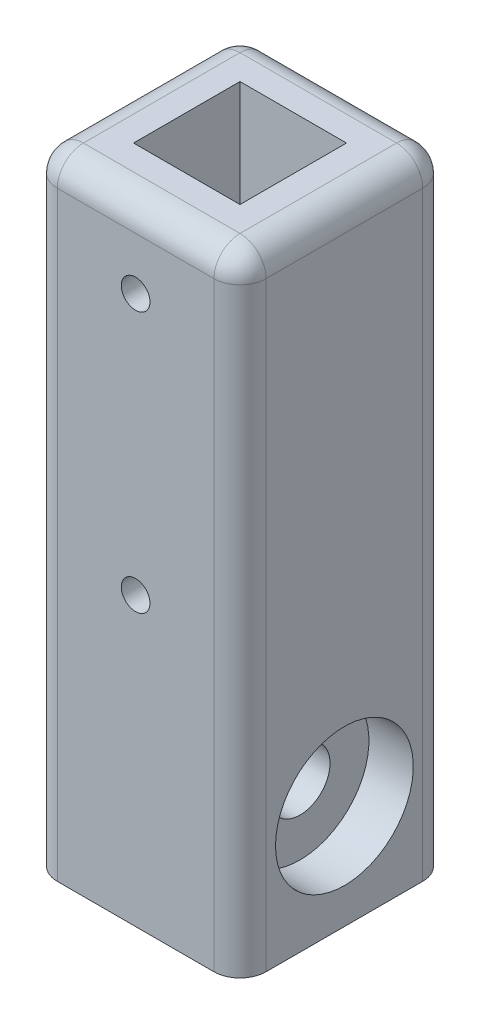
ISO-10303-21;
HEADER;
FILE_DESCRIPTION(('STEP AP214'),'2;1');
FILE_NAME('part.step','',(''),(''),'','','');
FILE_SCHEMA(('AUTOMOTIVE_DESIGN { 1 0 10303 214 1 1 1 1 }'));
ENDSEC;
DATA;
#1=APPLICATION_CONTEXT('core data for automotive mechanical design processes');
#2=APPLICATION_PROTOCOL_DEFINITION('international standard','automotive_design',2000,#1);
#3=PRODUCT_CONTEXT('',#1,'mechanical');
#4=PRODUCT('Part','Part','',(#3));
#5=PRODUCT_RELATED_PRODUCT_CATEGORY('part','',(#4));
#6=PRODUCT_DEFINITION_FORMATION('','',#4);
#7=PRODUCT_DEFINITION_CONTEXT('part definition',#1,'design');
#8=PRODUCT_DEFINITION('design','',#6,#7);
#9=PRODUCT_DEFINITION_SHAPE('','',#8);
#10=(LENGTH_UNIT() NAMED_UNIT(*) SI_UNIT(.MILLI.,.METRE.));
#11=(NAMED_UNIT(*) PLANE_ANGLE_UNIT() SI_UNIT($,.RADIAN.));
#12=(NAMED_UNIT(*) SI_UNIT($,.STERADIAN.) SOLID_ANGLE_UNIT());
#13=UNCERTAINTY_MEASURE_WITH_UNIT(LENGTH_MEASURE(1.E-05),#10,'distance_accuracy_value','');
#14=(GEOMETRIC_REPRESENTATION_CONTEXT(3) GLOBAL_UNCERTAINTY_ASSIGNED_CONTEXT((#13)) GLOBAL_UNIT_ASSIGNED_CONTEXT((#10,
#11,#12)) REPRESENTATION_CONTEXT('',''));
#15=CARTESIAN_POINT('',(0.,0.,0.));
#16=DIRECTION('',(0.,0.,1.));
#17=DIRECTION('',(1.,0.,0.));
#18=AXIS2_PLACEMENT_3D('',#15,#16,#17);
#19=CARTESIAN_POINT('',(0.,80.,0.));
#20=DIRECTION('',(0.,-1.,0.));
#21=DIRECTION('',(0.,0.,-1.));
#22=AXIS2_PLACEMENT_3D('',#19,#20,#21);
#23=PLANE('',#22);
#24=DIRECTION('',(0.,0.,1.));
#25=VECTOR('',#24,1.);
#26=CARTESIAN_POINT('',(-4.8,80.,0.));
#27=LINE('',#26,#25);
#28=CARTESIAN_POINT('',(-4.8,80.,-25.2));
#29=VERTEX_POINT('',#28);
#30=CARTESIAN_POINT('',(-4.8,80.,4.8));
#31=VERTEX_POINT('',#30);
#32=EDGE_CURVE('E225',#29,#31,#27,.T.);
#33=ORIENTED_EDGE('',*,*,#32,.T.);
#34=DIRECTION('',(1.,0.,0.));
#35=VECTOR('',#34,1.);
#36=CARTESIAN_POINT('',(0.,80.,4.8));
#37=LINE('',#36,#35);
#38=CARTESIAN_POINT('',(25.2,80.,4.8));
#39=VERTEX_POINT('',#38);
#40=EDGE_CURVE('E227',#31,#39,#37,.T.);
#41=ORIENTED_EDGE('',*,*,#40,.T.);
#42=DIRECTION('',(0.,0.,-1.));
#43=VECTOR('',#42,1.);
#44=CARTESIAN_POINT('',(25.2,80.,0.));
#45=LINE('',#44,#43);
#46=CARTESIAN_POINT('',(25.2,80.,-25.2));
#47=VERTEX_POINT('',#46);
#48=EDGE_CURVE('E221',#39,#47,#45,.T.);
#49=ORIENTED_EDGE('',*,*,#48,.T.);
#50=DIRECTION('',(-1.,0.,0.));
#51=VECTOR('',#50,1.);
#52=CARTESIAN_POINT('',(0.,80.,-25.2));
#53=LINE('',#52,#51);
#54=EDGE_CURVE('E223',#47,#29,#53,.T.);
#55=ORIENTED_EDGE('',*,*,#54,.T.);
#56=EDGE_LOOP('',(#33,#41,#49,#55));
#57=FACE_BOUND('',#56,.T.);
#58=DIRECTION('',(0.,0.,1.));
#59=VECTOR('',#58,1.);
#60=CARTESIAN_POINT('',(0.,80.,0.));
#61=LINE('',#60,#59);
#62=CARTESIAN_POINT('',(0.,80.,-20.4));
#63=VERTEX_POINT('',#62);
#64=CARTESIAN_POINT('',(0.,80.,0.));
#65=VERTEX_POINT('',#64);
#66=EDGE_CURVE('E157',#63,#65,#61,.T.);
#67=ORIENTED_EDGE('',*,*,#66,.F.);
#68=DIRECTION('',(-1.,0.,0.));
#69=VECTOR('',#68,1.);
#70=CARTESIAN_POINT('',(0.,80.,-20.4));
#71=LINE('',#70,#69);
#72=CARTESIAN_POINT('',(20.4,80.,-20.4));
#73=VERTEX_POINT('',#72);
#74=EDGE_CURVE('E177',#73,#63,#71,.T.);
#75=ORIENTED_EDGE('',*,*,#74,.F.);
#76=DIRECTION('',(0.,0.,-1.));
#77=VECTOR('',#76,1.);
#78=CARTESIAN_POINT('',(20.4,80.,0.));
#79=LINE('',#78,#77);
#80=CARTESIAN_POINT('',(20.4,80.,0.));
#81=VERTEX_POINT('',#80);
#82=EDGE_CURVE('E166',#81,#73,#79,.T.);
#83=ORIENTED_EDGE('',*,*,#82,.F.);
#84=DIRECTION('',(1.,0.,0.));
#85=VECTOR('',#84,1.);
#86=CARTESIAN_POINT('',(0.,80.,0.));
#87=LINE('',#86,#85);
#88=EDGE_CURVE('E314',#65,#81,#87,.T.);
#89=ORIENTED_EDGE('',*,*,#88,.F.);
#90=EDGE_LOOP('',(#67,#75,#83,#89));
#91=FACE_BOUND('',#90,.T.);
#92=ADVANCED_FACE('F44',(#57,#91),#23,.F.);
#93=CARTESIAN_POINT('',(-9.8,80.,9.8));
#94=DIRECTION('',(1.,0.,0.));
#95=DIRECTION('',(0.,0.,-1.));
#96=AXIS2_PLACEMENT_3D('',#93,#94,#95);
#97=PLANE('',#96);
#98=CARTESIAN_POINT('',(-9.8,-20.,-10.2));
#99=DIRECTION('',(-1.,0.,0.));
#100=DIRECTION('',(0.,0.,1.));
#101=AXIS2_PLACEMENT_3D('',#98,#99,#100);
#102=CIRCLE('',#101,13.2);
#103=CARTESIAN_POINT('',(-9.8,-20.,3.00000000000001));
#104=VERTEX_POINT('',#103);
#105=EDGE_CURVE('E278',#104,#104,#102,.T.);
#106=ORIENTED_EDGE('',*,*,#105,.F.);
#107=EDGE_LOOP('',(#106));
#108=FACE_BOUND('',#107,.T.);
#109=DIRECTION('',(0.,-1.,0.));
#110=VECTOR('',#109,1.);
#111=CARTESIAN_POINT('',(-9.8,80.,4.8));
#112=LINE('',#111,#110);
#113=CARTESIAN_POINT('',(-9.8,-40.,4.8));
#114=VERTEX_POINT('',#113);
#115=CARTESIAN_POINT('',(-9.8,75.,4.8));
#116=VERTEX_POINT('',#115);
#117=EDGE_CURVE('E183',#114,#116,#112,.F.);
#118=ORIENTED_EDGE('',*,*,#117,.T.);
#119=DIRECTION('',(0.,0.,1.));
#120=VECTOR('',#119,1.);
#121=CARTESIAN_POINT('',(-9.8,75.,9.8));
#122=LINE('',#121,#120);
#123=CARTESIAN_POINT('',(-9.8,75.,-25.2));
#124=VERTEX_POINT('',#123);
#125=EDGE_CURVE('E234',#116,#124,#122,.F.);
#126=ORIENTED_EDGE('',*,*,#125,.T.);
#127=DIRECTION('',(0.,-1.,0.));
#128=VECTOR('',#127,1.);
#129=CARTESIAN_POINT('',(-9.8,80.,-25.2));
#130=LINE('',#129,#128);
#131=CARTESIAN_POINT('',(-9.8,-40.,-25.2));
#132=VERTEX_POINT('',#131);
#133=EDGE_CURVE('E195',#124,#132,#130,.T.);
#134=ORIENTED_EDGE('',*,*,#133,.T.);
#135=DIRECTION('',(0.,0.,-1.));
#136=VECTOR('',#135,1.);
#137=CARTESIAN_POINT('',(-9.8,-40.,0.));
#138=LINE('',#137,#136);
#139=EDGE_CURVE('E310',#114,#132,#138,.T.);
#140=ORIENTED_EDGE('',*,*,#139,.F.);
#141=EDGE_LOOP('',(#118,#126,#134,#140));
#142=FACE_BOUND('',#141,.T.);
#143=ADVANCED_FACE('F326',(#108,#142),#97,.F.);
#144=CARTESIAN_POINT('',(-9.8,80.,9.8));
#145=DIRECTION('',(0.,0.,-1.));
#146=DIRECTION('',(-1.,0.,0.));
#147=AXIS2_PLACEMENT_3D('',#144,#145,#146);
#148=PLANE('',#147);
#149=CARTESIAN_POINT('',(10.2,15.,9.8));
#150=DIRECTION('',(0.,0.,-1.));
#151=DIRECTION('',(-1.,0.,0.));
#152=AXIS2_PLACEMENT_3D('',#149,#150,#151);
#153=CIRCLE('',#152,2.75);
#154=CARTESIAN_POINT('',(7.45,15.,9.8));
#155=VERTEX_POINT('',#154);
#156=EDGE_CURVE('E188',#155,#155,#153,.T.);
#157=ORIENTED_EDGE('',*,*,#156,.T.);
#158=EDGE_LOOP('',(#157));
#159=FACE_BOUND('',#158,.T.);
#160=CARTESIAN_POINT('',(10.2,65.,9.8));
#161=DIRECTION('',(0.,0.,-1.));
#162=DIRECTION('',(-1.,0.,0.));
#163=AXIS2_PLACEMENT_3D('',#160,#161,#162);
#164=CIRCLE('',#163,2.75);
#165=CARTESIAN_POINT('',(7.44999999999999,65.,9.8));
#166=VERTEX_POINT('',#165);
#167=EDGE_CURVE('E290',#166,#166,#164,.T.);
#168=ORIENTED_EDGE('',*,*,#167,.T.);
#169=EDGE_LOOP('',(#168));
#170=FACE_BOUND('',#169,.T.);
#171=DIRECTION('',(0.,-1.,0.));
#172=VECTOR('',#171,1.);
#173=CARTESIAN_POINT('',(25.2,80.,9.8));
#174=LINE('',#173,#172);
#175=CARTESIAN_POINT('',(25.2,-40.,9.8));
#176=VERTEX_POINT('',#175);
#177=CARTESIAN_POINT('',(25.2,75.,9.8));
#178=VERTEX_POINT('',#177);
#179=EDGE_CURVE('E209',#176,#178,#174,.F.);
#180=ORIENTED_EDGE('',*,*,#179,.T.);
#181=DIRECTION('',(1.,0.,0.));
#182=VECTOR('',#181,1.);
#183=CARTESIAN_POINT('',(-9.8,75.,9.8));
#184=LINE('',#183,#182);
#185=CARTESIAN_POINT('',(-4.8,75.,9.8));
#186=VERTEX_POINT('',#185);
#187=EDGE_CURVE('E230',#178,#186,#184,.F.);
#188=ORIENTED_EDGE('',*,*,#187,.T.);
#189=DIRECTION('',(0.,-1.,0.));
#190=VECTOR('',#189,1.);
#191=CARTESIAN_POINT('',(-4.8,80.,9.8));
#192=LINE('',#191,#190);
#193=CARTESIAN_POINT('',(-4.8,-40.,9.8));
#194=VERTEX_POINT('',#193);
#195=EDGE_CURVE('E212',#186,#194,#192,.T.);
#196=ORIENTED_EDGE('',*,*,#195,.T.);
#197=DIRECTION('',(1.,0.,0.));
#198=VECTOR('',#197,1.);
#199=CARTESIAN_POINT('',(0.,-40.,9.8));
#200=LINE('',#199,#198);
#201=EDGE_CURVE('E301',#194,#176,#200,.T.);
#202=ORIENTED_EDGE('',*,*,#201,.T.);
#203=EDGE_LOOP('',(#180,#188,#196,#202));
#204=FACE_BOUND('',#203,.T.);
#205=ADVANCED_FACE('F332',(#159,#170,#204),#148,.F.);
#206=CARTESIAN_POINT('',(30.2,80.,9.8));
#207=DIRECTION('',(-1.,0.,0.));
#208=DIRECTION('',(0.,0.,1.));
#209=AXIS2_PLACEMENT_3D('',#206,#207,#208);
#210=PLANE('',#209);
#211=CARTESIAN_POINT('',(30.2,-20.,-10.2));
#212=DIRECTION('',(-1.,0.,0.));
#213=DIRECTION('',(0.,0.,1.));
#214=AXIS2_PLACEMENT_3D('',#211,#212,#213);
#215=CIRCLE('',#214,13.2);
#216=CARTESIAN_POINT('',(30.2,-20.,3.));
#217=VERTEX_POINT('',#216);
#218=EDGE_CURVE('E272',#217,#217,#215,.T.);
#219=ORIENTED_EDGE('',*,*,#218,.T.);
#220=EDGE_LOOP('',(#219));
#221=FACE_BOUND('',#220,.T.);
#222=DIRECTION('',(0.,-1.,0.));
#223=VECTOR('',#222,1.);
#224=CARTESIAN_POINT('',(30.2,80.,-25.2));
#225=LINE('',#224,#223);
#226=CARTESIAN_POINT('',(30.2,-40.,-25.2));
#227=VERTEX_POINT('',#226);
#228=CARTESIAN_POINT('',(30.2,75.,-25.2));
#229=VERTEX_POINT('',#228);
#230=EDGE_CURVE('E214',#227,#229,#225,.F.);
#231=ORIENTED_EDGE('',*,*,#230,.T.);
#232=DIRECTION('',(0.,0.,-1.));
#233=VECTOR('',#232,1.);
#234=CARTESIAN_POINT('',(30.2,75.,9.8));
#235=LINE('',#234,#233);
#236=CARTESIAN_POINT('',(30.2,75.,4.8));
#237=VERTEX_POINT('',#236);
#238=EDGE_CURVE('E12',#229,#237,#235,.F.);
#239=ORIENTED_EDGE('',*,*,#238,.T.);
#240=DIRECTION('',(0.,-1.,0.));
#241=VECTOR('',#240,1.);
#242=CARTESIAN_POINT('',(30.2,80.,4.8));
#243=LINE('',#242,#241);
#244=CARTESIAN_POINT('',(30.2,-40.,4.8));
#245=VERTEX_POINT('',#244);
#246=EDGE_CURVE('E216',#237,#245,#243,.T.);
#247=ORIENTED_EDGE('',*,*,#246,.T.);
#248=DIRECTION('',(0.,0.,-1.));
#249=VECTOR('',#248,1.);
#250=CARTESIAN_POINT('',(30.2,-40.,0.));
#251=LINE('',#250,#249);
#252=EDGE_CURVE('E304',#245,#227,#251,.T.);
#253=ORIENTED_EDGE('',*,*,#252,.T.);
#254=EDGE_LOOP('',(#231,#239,#247,#253));
#255=FACE_BOUND('',#254,.T.);
#256=ADVANCED_FACE('F341',(#221,#255),#210,.F.);
#257=CARTESIAN_POINT('',(-9.8,80.,-30.2));
#258=DIRECTION('',(0.,0.,1.));
#259=DIRECTION('',(1.,0.,0.));
#260=AXIS2_PLACEMENT_3D('',#257,#258,#259);
#261=PLANE('',#260);
#262=CARTESIAN_POINT('',(10.2,15.,-30.2));
#263=DIRECTION('',(0.,0.,-1.));
#264=DIRECTION('',(-1.,0.,0.));
#265=AXIS2_PLACEMENT_3D('',#262,#263,#264);
#266=CIRCLE('',#265,2.75);
#267=CARTESIAN_POINT('',(7.45,15.,-30.2));
#268=VERTEX_POINT('',#267);
#269=EDGE_CURVE('E287',#268,#268,#266,.T.);
#270=ORIENTED_EDGE('',*,*,#269,.F.);
#271=EDGE_LOOP('',(#270));
#272=FACE_BOUND('',#271,.T.);
#273=CARTESIAN_POINT('',(10.2,65.,-30.2));
#274=DIRECTION('',(0.,0.,-1.));
#275=DIRECTION('',(-1.,0.,0.));
#276=AXIS2_PLACEMENT_3D('',#273,#274,#275);
#277=CIRCLE('',#276,2.75);
#278=CARTESIAN_POINT('',(7.44999999999999,65.,-30.2));
#279=VERTEX_POINT('',#278);
#280=EDGE_CURVE('E284',#279,#279,#277,.T.);
#281=ORIENTED_EDGE('',*,*,#280,.F.);
#282=EDGE_LOOP('',(#281));
#283=FACE_BOUND('',#282,.T.);
#284=DIRECTION('',(0.,-1.,0.));
#285=VECTOR('',#284,1.);
#286=CARTESIAN_POINT('',(-4.8,80.,-30.2));
#287=LINE('',#286,#285);
#288=CARTESIAN_POINT('',(-4.8,-40.,-30.2));
#289=VERTEX_POINT('',#288);
#290=CARTESIAN_POINT('',(-4.8,75.,-30.2));
#291=VERTEX_POINT('',#290);
#292=EDGE_CURVE('E207',#289,#291,#287,.F.);
#293=ORIENTED_EDGE('',*,*,#292,.T.);
#294=DIRECTION('',(-1.,0.,0.));
#295=VECTOR('',#294,1.);
#296=CARTESIAN_POINT('',(-9.8,75.,-30.2));
#297=LINE('',#296,#295);
#298=CARTESIAN_POINT('',(25.2,75.,-30.2));
#299=VERTEX_POINT('',#298);
#300=EDGE_CURVE('E68',#291,#299,#297,.F.);
#301=ORIENTED_EDGE('',*,*,#300,.T.);
#302=DIRECTION('',(0.,-1.,0.));
#303=VECTOR('',#302,1.);
#304=CARTESIAN_POINT('',(25.2,80.,-30.2));
#305=LINE('',#304,#303);
#306=CARTESIAN_POINT('',(25.2,-40.,-30.2));
#307=VERTEX_POINT('',#306);
#308=EDGE_CURVE('E205',#299,#307,#305,.T.);
#309=ORIENTED_EDGE('',*,*,#308,.T.);
#310=DIRECTION('',(1.,0.,0.));
#311=VECTOR('',#310,1.);
#312=CARTESIAN_POINT('',(0.,-40.,-30.2));
#313=LINE('',#312,#311);
#314=EDGE_CURVE('E307',#289,#307,#313,.T.);
#315=ORIENTED_EDGE('',*,*,#314,.F.);
#316=EDGE_LOOP('',(#293,#301,#309,#315));
#317=FACE_BOUND('',#316,.T.);
#318=ADVANCED_FACE('F338',(#272,#283,#317),#261,.F.);
#319=CARTESIAN_POINT('',(0.,80.,0.));
#320=DIRECTION('',(1.,0.,0.));
#321=DIRECTION('',(0.,0.,-1.));
#322=AXIS2_PLACEMENT_3D('',#319,#320,#321);
#323=PLANE('',#322);
#324=DIRECTION('',(0.,0.,1.));
#325=VECTOR('',#324,1.);
#326=CARTESIAN_POINT('',(0.,0.,0.));
#327=LINE('',#326,#325);
#328=CARTESIAN_POINT('',(0.,0.,-20.4));
#329=VERTEX_POINT('',#328);
#330=CARTESIAN_POINT('',(0.,0.,0.));
#331=VERTEX_POINT('',#330);
#332=EDGE_CURVE('E173',#329,#331,#327,.T.);
#333=ORIENTED_EDGE('',*,*,#332,.F.);
#334=DIRECTION('',(0.,-1.,0.));
#335=VECTOR('',#334,1.);
#336=CARTESIAN_POINT('',(0.,80.,-20.4));
#337=LINE('',#336,#335);
#338=EDGE_CURVE('E153',#63,#329,#337,.T.);
#339=ORIENTED_EDGE('',*,*,#338,.F.);
#340=ORIENTED_EDGE('',*,*,#66,.T.);
#341=DIRECTION('',(0.,-1.,0.));
#342=VECTOR('',#341,1.);
#343=CARTESIAN_POINT('',(0.,80.,0.));
#344=LINE('',#343,#342);
#345=EDGE_CURVE('E180',#65,#331,#344,.T.);
#346=ORIENTED_EDGE('',*,*,#345,.T.);
#347=EDGE_LOOP('',(#333,#339,#340,#346));
#348=FACE_BOUND('',#347,.T.);
#349=ADVANCED_FACE('F318',(#348),#323,.T.);
#350=CARTESIAN_POINT('',(0.,80.,0.));
#351=DIRECTION('',(0.,0.,-1.));
#352=DIRECTION('',(-1.,0.,0.));
#353=AXIS2_PLACEMENT_3D('',#350,#351,#352);
#354=PLANE('',#353);
#355=CARTESIAN_POINT('',(10.2,15.,0.));
#356=DIRECTION('',(0.,0.,-1.));
#357=DIRECTION('',(-1.,0.,0.));
#358=AXIS2_PLACEMENT_3D('',#355,#356,#357);
#359=CIRCLE('',#358,2.75);
#360=CARTESIAN_POINT('',(7.45,15.,0.));
#361=VERTEX_POINT('',#360);
#362=EDGE_CURVE('E192',#361,#361,#359,.T.);
#363=ORIENTED_EDGE('',*,*,#362,.F.);
#364=EDGE_LOOP('',(#363));
#365=FACE_BOUND('',#364,.T.);
#366=CARTESIAN_POINT('',(10.2,65.,0.));
#367=DIRECTION('',(0.,0.,-1.));
#368=DIRECTION('',(-1.,0.,0.));
#369=AXIS2_PLACEMENT_3D('',#366,#367,#368);
#370=CIRCLE('',#369,2.75);
#371=CARTESIAN_POINT('',(7.44999999999999,65.,0.));
#372=VERTEX_POINT('',#371);
#373=EDGE_CURVE('E187',#372,#372,#370,.T.);
#374=ORIENTED_EDGE('',*,*,#373,.F.);
#375=EDGE_LOOP('',(#374));
#376=FACE_BOUND('',#375,.T.);
#377=DIRECTION('',(1.,0.,0.));
#378=VECTOR('',#377,1.);
#379=CARTESIAN_POINT('',(0.,0.,0.));
#380=LINE('',#379,#378);
#381=CARTESIAN_POINT('',(20.4,0.,0.));
#382=VERTEX_POINT('',#381);
#383=EDGE_CURVE('E171',#331,#382,#380,.T.);
#384=ORIENTED_EDGE('',*,*,#383,.F.);
#385=ORIENTED_EDGE('',*,*,#345,.F.);
#386=ORIENTED_EDGE('',*,*,#88,.T.);
#387=DIRECTION('',(0.,-1.,0.));
#388=VECTOR('',#387,1.);
#389=CARTESIAN_POINT('',(20.4,80.,0.));
#390=LINE('',#389,#388);
#391=EDGE_CURVE('E168',#81,#382,#390,.T.);
#392=ORIENTED_EDGE('',*,*,#391,.T.);
#393=EDGE_LOOP('',(#384,#385,#386,#392));
#394=FACE_BOUND('',#393,.T.);
#395=ADVANCED_FACE('F323',(#365,#376,#394),#354,.T.);
#396=CARTESIAN_POINT('',(20.4,80.,0.));
#397=DIRECTION('',(-1.,0.,0.));
#398=DIRECTION('',(0.,0.,1.));
#399=AXIS2_PLACEMENT_3D('',#396,#397,#398);
#400=PLANE('',#399);
#401=DIRECTION('',(0.,0.,-1.));
#402=VECTOR('',#401,1.);
#403=CARTESIAN_POINT('',(20.4,0.,0.));
#404=LINE('',#403,#402);
#405=CARTESIAN_POINT('',(20.4,0.,-20.4));
#406=VERTEX_POINT('',#405);
#407=EDGE_CURVE('E158',#382,#406,#404,.T.);
#408=ORIENTED_EDGE('',*,*,#407,.F.);
#409=ORIENTED_EDGE('',*,*,#391,.F.);
#410=ORIENTED_EDGE('',*,*,#82,.T.);
#411=DIRECTION('',(0.,-1.,0.));
#412=VECTOR('',#411,1.);
#413=CARTESIAN_POINT('',(20.4,80.,-20.4));
#414=LINE('',#413,#412);
#415=EDGE_CURVE('E150',#73,#406,#414,.T.);
#416=ORIENTED_EDGE('',*,*,#415,.T.);
#417=EDGE_LOOP('',(#408,#409,#410,#416));
#418=FACE_BOUND('',#417,.T.);
#419=ADVANCED_FACE('F162',(#418),#400,.T.);
#420=CARTESIAN_POINT('',(0.,80.,-20.4));
#421=DIRECTION('',(0.,0.,1.));
#422=DIRECTION('',(1.,0.,0.));
#423=AXIS2_PLACEMENT_3D('',#420,#421,#422);
#424=PLANE('',#423);
#425=CARTESIAN_POINT('',(10.2,15.,-20.4));
#426=DIRECTION('',(0.,0.,1.));
#427=DIRECTION('',(1.,0.,0.));
#428=AXIS2_PLACEMENT_3D('',#425,#426,#427);
#429=CIRCLE('',#428,2.75);
#430=CARTESIAN_POINT('',(12.95,15.,-20.4));
#431=VERTEX_POINT('',#430);
#432=EDGE_CURVE('E189',#431,#431,#429,.T.);
#433=ORIENTED_EDGE('',*,*,#432,.F.);
#434=EDGE_LOOP('',(#433));
#435=FACE_BOUND('',#434,.T.);
#436=CARTESIAN_POINT('',(10.2,65.,-20.4));
#437=DIRECTION('',(0.,0.,1.));
#438=DIRECTION('',(1.,0.,0.));
#439=AXIS2_PLACEMENT_3D('',#436,#437,#438);
#440=CIRCLE('',#439,2.75);
#441=CARTESIAN_POINT('',(12.95,65.,-20.4));
#442=VERTEX_POINT('',#441);
#443=EDGE_CURVE('E184',#442,#442,#440,.T.);
#444=ORIENTED_EDGE('',*,*,#443,.F.);
#445=EDGE_LOOP('',(#444));
#446=FACE_BOUND('',#445,.T.);
#447=DIRECTION('',(-1.,0.,0.));
#448=VECTOR('',#447,1.);
#449=CARTESIAN_POINT('',(0.,0.,-20.4));
#450=LINE('',#449,#448);
#451=EDGE_CURVE('E147',#406,#329,#450,.T.);
#452=ORIENTED_EDGE('',*,*,#451,.F.);
#453=ORIENTED_EDGE('',*,*,#415,.F.);
#454=ORIENTED_EDGE('',*,*,#74,.T.);
#455=ORIENTED_EDGE('',*,*,#338,.T.);
#456=EDGE_LOOP('',(#452,#453,#454,#455));
#457=FACE_BOUND('',#456,.T.);
#458=ADVANCED_FACE('F149',(#435,#446,#457),#424,.T.);
#459=CARTESIAN_POINT('',(0.,0.,0.));
#460=DIRECTION('',(0.,1.,0.));
#461=DIRECTION('',(0.,0.,1.));
#462=AXIS2_PLACEMENT_3D('',#459,#460,#461);
#463=PLANE('',#462);
#464=ORIENTED_EDGE('',*,*,#407,.T.);
#465=ORIENTED_EDGE('',*,*,#451,.T.);
#466=ORIENTED_EDGE('',*,*,#332,.T.);
#467=ORIENTED_EDGE('',*,*,#383,.T.);
#468=EDGE_LOOP('',(#464,#465,#466,#467));
#469=FACE_BOUND('',#468,.T.);
#470=ADVANCED_FACE('F170',(#469),#463,.T.);
#471=CARTESIAN_POINT('',(0.,-40.,0.));
#472=DIRECTION('',(0.,1.,0.));
#473=DIRECTION('',(0.,0.,1.));
#474=AXIS2_PLACEMENT_3D('',#471,#472,#473);
#475=PLANE('',#474);
#476=ORIENTED_EDGE('',*,*,#139,.T.);
#477=CARTESIAN_POINT('',(-4.8,-40.,-25.2));
#478=DIRECTION('',(0.,1.,0.));
#479=DIRECTION('',(0.,0.,1.));
#480=AXIS2_PLACEMENT_3D('',#477,#478,#479);
#481=CIRCLE('',#480,5.);
#482=EDGE_CURVE('E203',#132,#289,#481,.F.);
#483=ORIENTED_EDGE('',*,*,#482,.T.);
#484=ORIENTED_EDGE('',*,*,#314,.T.);
#485=CARTESIAN_POINT('',(25.2,-40.,-25.2));
#486=DIRECTION('',(0.,1.,0.));
#487=DIRECTION('',(0.,0.,1.));
#488=AXIS2_PLACEMENT_3D('',#485,#486,#487);
#489=CIRCLE('',#488,5.);
#490=EDGE_CURVE('E197',#307,#227,#489,.F.);
#491=ORIENTED_EDGE('',*,*,#490,.T.);
#492=ORIENTED_EDGE('',*,*,#252,.F.);
#493=CARTESIAN_POINT('',(25.2,-40.,4.8));
#494=DIRECTION('',(0.,1.,0.));
#495=DIRECTION('',(0.,0.,1.));
#496=AXIS2_PLACEMENT_3D('',#493,#494,#495);
#497=CIRCLE('',#496,5.);
#498=EDGE_CURVE('E199',#245,#176,#497,.F.);
#499=ORIENTED_EDGE('',*,*,#498,.T.);
#500=ORIENTED_EDGE('',*,*,#201,.F.);
#501=CARTESIAN_POINT('',(-4.8,-40.,4.8));
#502=DIRECTION('',(0.,1.,0.));
#503=DIRECTION('',(0.,0.,1.));
#504=AXIS2_PLACEMENT_3D('',#501,#502,#503);
#505=CIRCLE('',#504,5.);
#506=EDGE_CURVE('E201',#194,#114,#505,.F.);
#507=ORIENTED_EDGE('',*,*,#506,.T.);
#508=EDGE_LOOP('',(#476,#483,#484,#491,#492,#499,#500,#507));
#509=FACE_BOUND('',#508,.T.);
#510=ADVANCED_FACE('F425',(#509),#475,.F.);
#511=CARTESIAN_POINT('',(10.2,65.,9.8));
#512=DIRECTION('',(0.,0.,-1.));
#513=DIRECTION('',(-1.,0.,0.));
#514=AXIS2_PLACEMENT_3D('',#511,#512,#513);
#515=CYLINDRICAL_SURFACE('',#514,2.75);
#516=ORIENTED_EDGE('',*,*,#443,.T.);
#517=EDGE_LOOP('',(#516));
#518=FACE_BOUND('',#517,.T.);
#519=ORIENTED_EDGE('',*,*,#280,.T.);
#520=EDGE_LOOP('',(#519));
#521=FACE_BOUND('',#520,.T.);
#522=ADVANCED_FACE('F428',(#518,#521),#515,.F.);
#523=CARTESIAN_POINT('',(10.2,15.,9.8));
#524=DIRECTION('',(0.,0.,-1.));
#525=DIRECTION('',(-1.,0.,0.));
#526=AXIS2_PLACEMENT_3D('',#523,#524,#525);
#527=CYLINDRICAL_SURFACE('',#526,2.75);
#528=ORIENTED_EDGE('',*,*,#432,.T.);
#529=EDGE_LOOP('',(#528));
#530=FACE_BOUND('',#529,.T.);
#531=ORIENTED_EDGE('',*,*,#269,.T.);
#532=EDGE_LOOP('',(#531));
#533=FACE_BOUND('',#532,.T.);
#534=ADVANCED_FACE('F434',(#530,#533),#527,.F.);
#535=ORIENTED_EDGE('',*,*,#373,.T.);
#536=EDGE_LOOP('',(#535));
#537=FACE_BOUND('',#536,.T.);
#538=ORIENTED_EDGE('',*,*,#167,.F.);
#539=EDGE_LOOP('',(#538));
#540=FACE_BOUND('',#539,.T.);
#541=ADVANCED_FACE('F437',(#537,#540),#515,.F.);
#542=ORIENTED_EDGE('',*,*,#362,.T.);
#543=EDGE_LOOP('',(#542));
#544=FACE_BOUND('',#543,.T.);
#545=ORIENTED_EDGE('',*,*,#156,.F.);
#546=EDGE_LOOP('',(#545));
#547=FACE_BOUND('',#546,.T.);
#548=ADVANCED_FACE('F456',(#544,#547),#527,.F.);
#549=CARTESIAN_POINT('',(-1.3,-20.,-10.2));
#550=DIRECTION('',(-1.,0.,0.));
#551=DIRECTION('',(0.,0.,1.));
#552=AXIS2_PLACEMENT_3D('',#549,#550,#551);
#553=CYLINDRICAL_SURFACE('',#552,13.2);
#554=CARTESIAN_POINT('',(-1.3,-20.,-10.2));
#555=DIRECTION('',(-1.,0.,0.));
#556=DIRECTION('',(0.,0.,1.));
#557=AXIS2_PLACEMENT_3D('',#554,#555,#556);
#558=CIRCLE('',#557,13.2);
#559=CARTESIAN_POINT('',(-1.3,-20.,3.));
#560=VERTEX_POINT('',#559);
#561=EDGE_CURVE('E281',#560,#560,#558,.T.);
#562=ORIENTED_EDGE('',*,*,#561,.F.);
#563=EDGE_LOOP('',(#562));
#564=FACE_BOUND('',#563,.T.);
#565=ORIENTED_EDGE('',*,*,#105,.T.);
#566=EDGE_LOOP('',(#565));
#567=FACE_BOUND('',#566,.T.);
#568=ADVANCED_FACE('F463',(#564,#567),#553,.F.);
#569=CARTESIAN_POINT('',(-1.3,0.,0.));
#570=DIRECTION('',(-1.,0.,0.));
#571=DIRECTION('',(0.,0.,1.));
#572=AXIS2_PLACEMENT_3D('',#569,#570,#571);
#573=PLANE('',#572);
#574=CARTESIAN_POINT('',(-1.3,-20.,-10.2));
#575=DIRECTION('',(-1.,0.,0.));
#576=DIRECTION('',(0.,0.,1.));
#577=AXIS2_PLACEMENT_3D('',#574,#575,#576);
#578=CIRCLE('',#577,5.75);
#579=CARTESIAN_POINT('',(-1.3,-20.,-4.45));
#580=VERTEX_POINT('',#579);
#581=EDGE_CURVE('E267',#580,#580,#578,.T.);
#582=ORIENTED_EDGE('',*,*,#581,.F.);
#583=EDGE_LOOP('',(#582));
#584=FACE_BOUND('',#583,.T.);
#585=ORIENTED_EDGE('',*,*,#561,.T.);
#586=EDGE_LOOP('',(#585));
#587=FACE_BOUND('',#586,.T.);
#588=ADVANCED_FACE('F472',(#584,#587),#573,.T.);
#589=CARTESIAN_POINT('',(21.7,-20.,-10.2));
#590=DIRECTION('',(-1.,0.,0.));
#591=DIRECTION('',(0.,0.,1.));
#592=AXIS2_PLACEMENT_3D('',#589,#590,#591);
#593=PLANE('',#592);
#594=CARTESIAN_POINT('',(21.7,-20.,-10.2));
#595=DIRECTION('',(-1.,0.,0.));
#596=DIRECTION('',(0.,0.,1.));
#597=AXIS2_PLACEMENT_3D('',#594,#595,#596);
#598=CIRCLE('',#597,13.2);
#599=CARTESIAN_POINT('',(21.7,-20.,3.));
#600=VERTEX_POINT('',#599);
#601=EDGE_CURVE('E275',#600,#600,#598,.T.);
#602=ORIENTED_EDGE('',*,*,#601,.F.);
#603=EDGE_LOOP('',(#602));
#604=FACE_BOUND('',#603,.T.);
#605=CARTESIAN_POINT('',(21.7,-20.,-10.2));
#606=DIRECTION('',(-1.,0.,0.));
#607=DIRECTION('',(0.,0.,1.));
#608=AXIS2_PLACEMENT_3D('',#605,#606,#607);
#609=CIRCLE('',#608,5.75);
#610=CARTESIAN_POINT('',(21.7,-20.,-4.45));
#611=VERTEX_POINT('',#610);
#612=EDGE_CURVE('E262',#611,#611,#609,.T.);
#613=ORIENTED_EDGE('',*,*,#612,.T.);
#614=EDGE_LOOP('',(#613));
#615=FACE_BOUND('',#614,.T.);
#616=ADVANCED_FACE('F476',(#604,#615),#593,.F.);
#617=CARTESIAN_POINT('',(21.7,-20.,-10.2));
#618=DIRECTION('',(1.,0.,0.));
#619=DIRECTION('',(0.,0.,-1.));
#620=AXIS2_PLACEMENT_3D('',#617,#618,#619);
#621=CYLINDRICAL_SURFACE('',#620,13.2);
#622=ORIENTED_EDGE('',*,*,#601,.T.);
#623=EDGE_LOOP('',(#622));
#624=FACE_BOUND('',#623,.T.);
#625=ORIENTED_EDGE('',*,*,#218,.F.);
#626=EDGE_LOOP('',(#625));
#627=FACE_BOUND('',#626,.T.);
#628=ADVANCED_FACE('F478',(#624,#627),#621,.F.);
#629=CARTESIAN_POINT('',(30.2,-20.,-10.2));
#630=DIRECTION('',(-1.,0.,0.));
#631=DIRECTION('',(0.,0.,1.));
#632=AXIS2_PLACEMENT_3D('',#629,#630,#631);
#633=CYLINDRICAL_SURFACE('',#632,5.75);
#634=ORIENTED_EDGE('',*,*,#581,.T.);
#635=EDGE_LOOP('',(#634));
#636=FACE_BOUND('',#635,.T.);
#637=ORIENTED_EDGE('',*,*,#612,.F.);
#638=EDGE_LOOP('',(#637));
#639=FACE_BOUND('',#638,.T.);
#640=ADVANCED_FACE('F353',(#636,#639),#633,.F.);
#641=CARTESIAN_POINT('',(-4.8,80.,-25.2));
#642=DIRECTION('',(0.,-1.,0.));
#643=DIRECTION('',(0.,0.,-1.));
#644=AXIS2_PLACEMENT_3D('',#641,#642,#643);
#645=CYLINDRICAL_SURFACE('',#644,5.);
#646=ORIENTED_EDGE('',*,*,#133,.F.);
#647=CARTESIAN_POINT('',(-4.8,75.,-25.2));
#648=DIRECTION('',(0.,-1.,0.));
#649=DIRECTION('',(0.,0.,-1.));
#650=AXIS2_PLACEMENT_3D('',#647,#648,#649);
#651=CIRCLE('',#650,5.);
#652=EDGE_CURVE('E236',#124,#291,#651,.T.);
#653=ORIENTED_EDGE('',*,*,#652,.T.);
#654=ORIENTED_EDGE('',*,*,#292,.F.);
#655=ORIENTED_EDGE('',*,*,#482,.F.);
#656=EDGE_LOOP('',(#646,#653,#654,#655));
#657=FACE_BOUND('',#656,.T.);
#658=ADVANCED_FACE('F349',(#657),#645,.T.);
#659=CARTESIAN_POINT('',(-4.8,80.,4.8));
#660=DIRECTION('',(0.,-1.,0.));
#661=DIRECTION('',(0.,0.,-1.));
#662=AXIS2_PLACEMENT_3D('',#659,#660,#661);
#663=CYLINDRICAL_SURFACE('',#662,5.);
#664=ORIENTED_EDGE('',*,*,#195,.F.);
#665=CARTESIAN_POINT('',(-4.8,75.,4.8));
#666=DIRECTION('',(0.,-1.,0.));
#667=DIRECTION('',(0.,0.,-1.));
#668=AXIS2_PLACEMENT_3D('',#665,#666,#667);
#669=CIRCLE('',#668,5.);
#670=EDGE_CURVE('E232',#186,#116,#669,.T.);
#671=ORIENTED_EDGE('',*,*,#670,.T.);
#672=ORIENTED_EDGE('',*,*,#117,.F.);
#673=ORIENTED_EDGE('',*,*,#506,.F.);
#674=EDGE_LOOP('',(#664,#671,#672,#673));
#675=FACE_BOUND('',#674,.T.);
#676=ADVANCED_FACE('F352',(#675),#663,.T.);
#677=CARTESIAN_POINT('',(25.2,80.,4.8));
#678=DIRECTION('',(0.,-1.,0.));
#679=DIRECTION('',(0.,0.,-1.));
#680=AXIS2_PLACEMENT_3D('',#677,#678,#679);
#681=CYLINDRICAL_SURFACE('',#680,5.);
#682=ORIENTED_EDGE('',*,*,#246,.F.);
#683=CARTESIAN_POINT('',(25.2,75.,4.8));
#684=DIRECTION('',(0.,-1.,0.));
#685=DIRECTION('',(0.,0.,-1.));
#686=AXIS2_PLACEMENT_3D('',#683,#684,#685);
#687=CIRCLE('',#686,5.);
#688=EDGE_CURVE('E218',#237,#178,#687,.T.);
#689=ORIENTED_EDGE('',*,*,#688,.T.);
#690=ORIENTED_EDGE('',*,*,#179,.F.);
#691=ORIENTED_EDGE('',*,*,#498,.F.);
#692=EDGE_LOOP('',(#682,#689,#690,#691));
#693=FACE_BOUND('',#692,.T.);
#694=ADVANCED_FACE('F357',(#693),#681,.T.);
#695=CARTESIAN_POINT('',(25.2,80.,-25.2));
#696=DIRECTION('',(0.,-1.,0.));
#697=DIRECTION('',(0.,0.,-1.));
#698=AXIS2_PLACEMENT_3D('',#695,#696,#697);
#699=CYLINDRICAL_SURFACE('',#698,5.);
#700=ORIENTED_EDGE('',*,*,#308,.F.);
#701=CARTESIAN_POINT('',(25.2,75.,-25.2));
#702=DIRECTION('',(0.,-1.,0.));
#703=DIRECTION('',(0.,0.,-1.));
#704=AXIS2_PLACEMENT_3D('',#701,#702,#703);
#705=CIRCLE('',#704,5.);
#706=EDGE_CURVE('E53',#299,#229,#705,.T.);
#707=ORIENTED_EDGE('',*,*,#706,.T.);
#708=ORIENTED_EDGE('',*,*,#230,.F.);
#709=ORIENTED_EDGE('',*,*,#490,.F.);
#710=EDGE_LOOP('',(#700,#707,#708,#709));
#711=FACE_BOUND('',#710,.T.);
#712=ADVANCED_FACE('F361',(#711),#699,.T.);
#713=CARTESIAN_POINT('',(-4.8,75.,-25.2));
#714=DIRECTION('',(0.,-1.,0.));
#715=DIRECTION('',(0.,0.,-1.));
#716=AXIS2_PLACEMENT_3D('',#713,#714,#715);
#717=SPHERICAL_SURFACE('',#716,5.);
#718=CARTESIAN_POINT('',(-4.8,75.,-25.2));
#719=DIRECTION('',(1.,0.,0.));
#720=DIRECTION('',(0.,0.,-1.));
#721=AXIS2_PLACEMENT_3D('',#718,#719,#720);
#722=CIRCLE('',#721,5.);
#723=EDGE_CURVE('E255',#291,#29,#722,.T.);
#724=ORIENTED_EDGE('',*,*,#723,.F.);
#725=ORIENTED_EDGE('',*,*,#652,.F.);
#726=CARTESIAN_POINT('',(-4.8,75.,-25.2));
#727=DIRECTION('',(0.,0.,1.));
#728=DIRECTION('',(1.,0.,0.));
#729=AXIS2_PLACEMENT_3D('',#726,#727,#728);
#730=CIRCLE('',#729,5.);
#731=EDGE_CURVE('E48',#29,#124,#730,.T.);
#732=ORIENTED_EDGE('',*,*,#731,.F.);
#733=EDGE_LOOP('',(#724,#725,#732));
#734=FACE_BOUND('',#733,.T.);
#735=ADVANCED_FACE('F46',(#734),#717,.T.);
#736=CARTESIAN_POINT('',(-4.8,75.,0.));
#737=DIRECTION('',(0.,0.,1.));
#738=DIRECTION('',(1.,0.,0.));
#739=AXIS2_PLACEMENT_3D('',#736,#737,#738);
#740=CYLINDRICAL_SURFACE('',#739,5.);
#741=ORIENTED_EDGE('',*,*,#731,.T.);
#742=ORIENTED_EDGE('',*,*,#125,.F.);
#743=CARTESIAN_POINT('',(-4.8,75.,4.8));
#744=DIRECTION('',(0.,0.,1.));
#745=DIRECTION('',(1.,0.,0.));
#746=AXIS2_PLACEMENT_3D('',#743,#744,#745);
#747=CIRCLE('',#746,5.);
#748=EDGE_CURVE('E253',#31,#116,#747,.T.);
#749=ORIENTED_EDGE('',*,*,#748,.F.);
#750=ORIENTED_EDGE('',*,*,#32,.F.);
#751=EDGE_LOOP('',(#741,#742,#749,#750));
#752=FACE_BOUND('',#751,.T.);
#753=ADVANCED_FACE('F387',(#752),#740,.T.);
#754=CARTESIAN_POINT('',(0.,75.,-25.2));
#755=DIRECTION('',(-1.,0.,0.));
#756=DIRECTION('',(0.,0.,1.));
#757=AXIS2_PLACEMENT_3D('',#754,#755,#756);
#758=CYLINDRICAL_SURFACE('',#757,5.);
#759=ORIENTED_EDGE('',*,*,#723,.T.);
#760=ORIENTED_EDGE('',*,*,#54,.F.);
#761=CARTESIAN_POINT('',(25.2,75.,-25.2));
#762=DIRECTION('',(1.,0.,0.));
#763=DIRECTION('',(0.,0.,-1.));
#764=AXIS2_PLACEMENT_3D('',#761,#762,#763);
#765=CIRCLE('',#764,5.);
#766=EDGE_CURVE('E250',#299,#47,#765,.T.);
#767=ORIENTED_EDGE('',*,*,#766,.F.);
#768=ORIENTED_EDGE('',*,*,#300,.F.);
#769=EDGE_LOOP('',(#759,#760,#767,#768));
#770=FACE_BOUND('',#769,.T.);
#771=ADVANCED_FACE('F384',(#770),#758,.T.);
#772=CARTESIAN_POINT('',(-4.8,75.,4.8));
#773=DIRECTION('',(0.,-1.,0.));
#774=DIRECTION('',(0.,0.,-1.));
#775=AXIS2_PLACEMENT_3D('',#772,#773,#774);
#776=SPHERICAL_SURFACE('',#775,5.);
#777=ORIENTED_EDGE('',*,*,#748,.T.);
#778=ORIENTED_EDGE('',*,*,#670,.F.);
#779=CARTESIAN_POINT('',(-4.8,75.,4.8));
#780=DIRECTION('',(1.,0.,0.));
#781=DIRECTION('',(0.,0.,-1.));
#782=AXIS2_PLACEMENT_3D('',#779,#780,#781);
#783=CIRCLE('',#782,5.);
#784=EDGE_CURVE('E247',#31,#186,#783,.T.);
#785=ORIENTED_EDGE('',*,*,#784,.F.);
#786=EDGE_LOOP('',(#777,#778,#785));
#787=FACE_BOUND('',#786,.T.);
#788=ADVANCED_FACE('F380',(#787),#776,.T.);
#789=CARTESIAN_POINT('',(25.2,75.,-25.2));
#790=DIRECTION('',(0.,-1.,0.));
#791=DIRECTION('',(0.,0.,-1.));
#792=AXIS2_PLACEMENT_3D('',#789,#790,#791);
#793=SPHERICAL_SURFACE('',#792,5.);
#794=ORIENTED_EDGE('',*,*,#706,.F.);
#795=ORIENTED_EDGE('',*,*,#766,.T.);
#796=CARTESIAN_POINT('',(25.2,75.,-25.2));
#797=DIRECTION('',(0.,0.,1.));
#798=DIRECTION('',(1.,0.,0.));
#799=AXIS2_PLACEMENT_3D('',#796,#797,#798);
#800=CIRCLE('',#799,5.);
#801=EDGE_CURVE('E244',#229,#47,#800,.T.);
#802=ORIENTED_EDGE('',*,*,#801,.F.);
#803=EDGE_LOOP('',(#794,#795,#802));
#804=FACE_BOUND('',#803,.T.);
#805=ADVANCED_FACE('F376',(#804),#793,.T.);
#806=CARTESIAN_POINT('',(0.,75.,4.8));
#807=DIRECTION('',(1.,0.,0.));
#808=DIRECTION('',(0.,0.,-1.));
#809=AXIS2_PLACEMENT_3D('',#806,#807,#808);
#810=CYLINDRICAL_SURFACE('',#809,5.);
#811=ORIENTED_EDGE('',*,*,#784,.T.);
#812=ORIENTED_EDGE('',*,*,#187,.F.);
#813=CARTESIAN_POINT('',(25.2,75.,4.8));
#814=DIRECTION('',(1.,0.,0.));
#815=DIRECTION('',(0.,0.,-1.));
#816=AXIS2_PLACEMENT_3D('',#813,#814,#815);
#817=CIRCLE('',#816,5.);
#818=EDGE_CURVE('E242',#39,#178,#817,.T.);
#819=ORIENTED_EDGE('',*,*,#818,.F.);
#820=ORIENTED_EDGE('',*,*,#40,.F.);
#821=EDGE_LOOP('',(#811,#812,#819,#820));
#822=FACE_BOUND('',#821,.T.);
#823=ADVANCED_FACE('F372',(#822),#810,.T.);
#824=CARTESIAN_POINT('',(25.2,75.,0.));
#825=DIRECTION('',(0.,0.,-1.));
#826=DIRECTION('',(-1.,0.,0.));
#827=AXIS2_PLACEMENT_3D('',#824,#825,#826);
#828=CYLINDRICAL_SURFACE('',#827,5.);
#829=ORIENTED_EDGE('',*,*,#801,.T.);
#830=ORIENTED_EDGE('',*,*,#48,.F.);
#831=CARTESIAN_POINT('',(25.2,75.,4.8));
#832=DIRECTION('',(0.,0.,1.));
#833=DIRECTION('',(0.,-1.,0.));
#834=AXIS2_PLACEMENT_3D('',#831,#832,#833);
#835=CIRCLE('',#834,5.);
#836=EDGE_CURVE('E240',#237,#39,#835,.T.);
#837=ORIENTED_EDGE('',*,*,#836,.F.);
#838=ORIENTED_EDGE('',*,*,#238,.F.);
#839=EDGE_LOOP('',(#829,#830,#837,#838));
#840=FACE_BOUND('',#839,.T.);
#841=ADVANCED_FACE('F368',(#840),#828,.T.);
#842=CARTESIAN_POINT('',(25.2,75.,4.8));
#843=DIRECTION('',(0.,-1.,0.));
#844=DIRECTION('',(0.,0.,-1.));
#845=AXIS2_PLACEMENT_3D('',#842,#843,#844);
#846=SPHERICAL_SURFACE('',#845,5.);
#847=ORIENTED_EDGE('',*,*,#818,.T.);
#848=ORIENTED_EDGE('',*,*,#688,.F.);
#849=ORIENTED_EDGE('',*,*,#836,.T.);
#850=EDGE_LOOP('',(#847,#848,#849));
#851=FACE_BOUND('',#850,.T.);
#852=ADVANCED_FACE('F365',(#851),#846,.T.);
#853=CLOSED_SHELL('',(#92,#143,#205,#256,#318,#349,#395,#419,#458,#470,#510,#522,#534,#541,#548,
#568,#588,#616,#628,#640,#658,#676,#694,#712,#735,#753,#771,#788,#805,#823,#841,#852));
#854=MANIFOLD_SOLID_BREP('B2',#853);
#855=ADVANCED_BREP_SHAPE_REPRESENTATION('',(#18,#854),#14);
#856=SHAPE_DEFINITION_REPRESENTATION(#9,#855);
ENDSEC;
END-ISO-10303-21;
